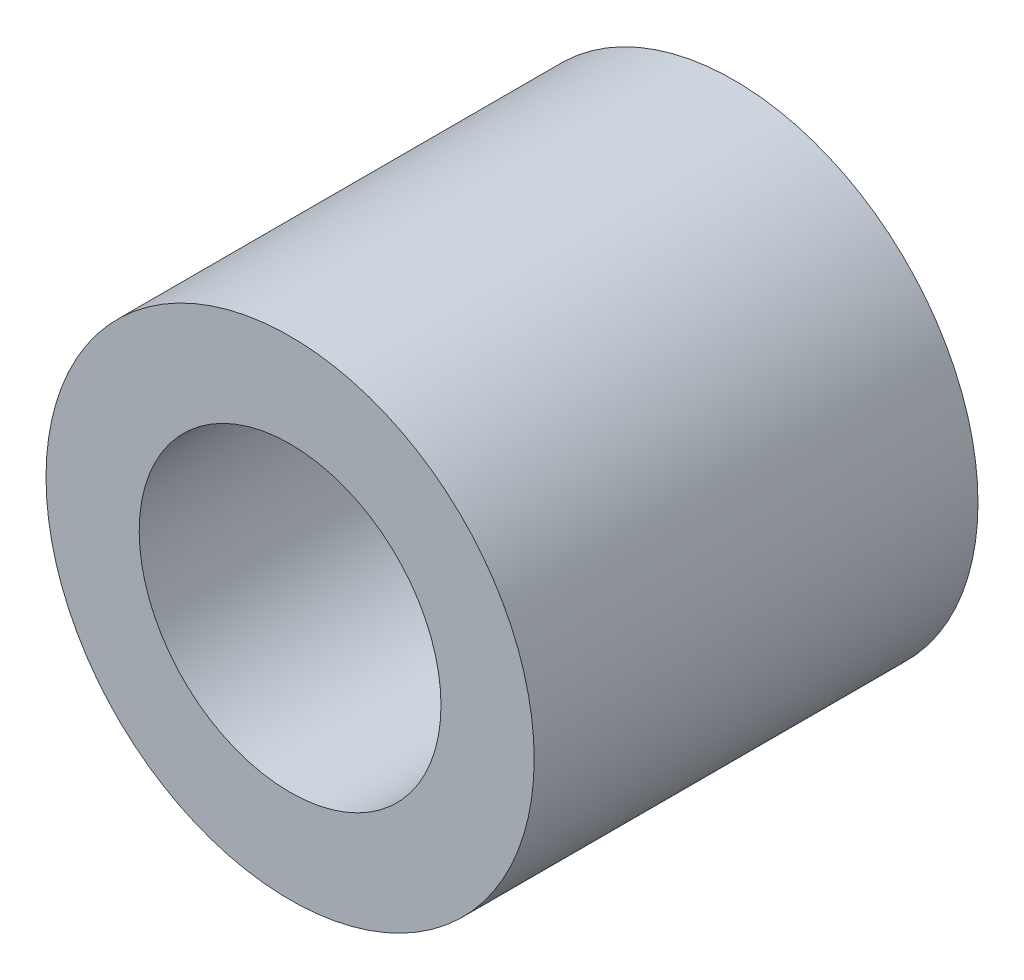
ISO-10303-21;
HEADER;
FILE_DESCRIPTION(('STEP AP214'),'2;1');
FILE_NAME('part.step','',(''),(''),'','','');
FILE_SCHEMA(('AUTOMOTIVE_DESIGN { 1 0 10303 214 1 1 1 1 }'));
ENDSEC;
DATA;
#1=APPLICATION_CONTEXT('core data for automotive mechanical design processes');
#2=APPLICATION_PROTOCOL_DEFINITION('international standard','automotive_design',2000,#1);
#3=PRODUCT_CONTEXT('',#1,'mechanical');
#4=PRODUCT('Part','Part','',(#3));
#5=PRODUCT_RELATED_PRODUCT_CATEGORY('part','',(#4));
#6=PRODUCT_DEFINITION_FORMATION('','',#4);
#7=PRODUCT_DEFINITION_CONTEXT('part definition',#1,'design');
#8=PRODUCT_DEFINITION('design','',#6,#7);
#9=PRODUCT_DEFINITION_SHAPE('','',#8);
#10=(LENGTH_UNIT() NAMED_UNIT(*) SI_UNIT(.MILLI.,.METRE.));
#11=(NAMED_UNIT(*) PLANE_ANGLE_UNIT() SI_UNIT($,.RADIAN.));
#12=(NAMED_UNIT(*) SI_UNIT($,.STERADIAN.) SOLID_ANGLE_UNIT());
#13=UNCERTAINTY_MEASURE_WITH_UNIT(LENGTH_MEASURE(1.E-05),#10,'distance_accuracy_value','');
#14=(GEOMETRIC_REPRESENTATION_CONTEXT(3) GLOBAL_UNCERTAINTY_ASSIGNED_CONTEXT((#13)) GLOBAL_UNIT_ASSIGNED_CONTEXT((#10,
#11,#12)) REPRESENTATION_CONTEXT('',''));
#15=CARTESIAN_POINT('',(0.,0.,0.));
#16=DIRECTION('',(0.,0.,1.));
#17=DIRECTION('',(1.,0.,0.));
#18=AXIS2_PLACEMENT_3D('',#15,#16,#17);
#19=CARTESIAN_POINT('',(0.,0.,5.));
#20=DIRECTION('',(0.,0.,1.));
#21=DIRECTION('',(1.,0.,0.));
#22=AXIS2_PLACEMENT_3D('',#19,#20,#21);
#23=PLANE('',#22);
#24=CARTESIAN_POINT('',(0.,0.,5.));
#25=DIRECTION('',(0.,0.,1.));
#26=DIRECTION('',(1.,0.,0.));
#27=AXIS2_PLACEMENT_3D('',#24,#25,#26);
#28=CIRCLE('',#27,2.75);
#29=CARTESIAN_POINT('',(2.75,0.,5.));
#30=VERTEX_POINT('',#29);
#31=EDGE_CURVE('E10',#30,#30,#28,.T.);
#32=ORIENTED_EDGE('',*,*,#31,.T.);
#33=EDGE_LOOP('',(#32));
#34=FACE_BOUND('',#33,.T.);
#35=CARTESIAN_POINT('',(0.,0.,5.));
#36=DIRECTION('',(0.,0.,1.));
#37=DIRECTION('',(1.,0.,0.));
#38=AXIS2_PLACEMENT_3D('',#35,#36,#37);
#39=CIRCLE('',#38,1.7);
#40=CARTESIAN_POINT('',(1.7,0.,5.));
#41=VERTEX_POINT('',#40);
#42=EDGE_CURVE('E56',#41,#41,#39,.T.);
#43=ORIENTED_EDGE('',*,*,#42,.F.);
#44=EDGE_LOOP('',(#43));
#45=FACE_BOUND('',#44,.T.);
#46=ADVANCED_FACE('F43',(#34,#45),#23,.T.);
#47=CARTESIAN_POINT('',(0.,0.,0.));
#48=DIRECTION('',(0.,0.,1.));
#49=DIRECTION('',(1.,0.,0.));
#50=AXIS2_PLACEMENT_3D('',#47,#48,#49);
#51=PLANE('',#50);
#52=CARTESIAN_POINT('',(0.,0.,0.));
#53=DIRECTION('',(0.,0.,1.));
#54=DIRECTION('',(1.,0.,0.));
#55=AXIS2_PLACEMENT_3D('',#52,#53,#54);
#56=CIRCLE('',#55,2.75);
#57=CARTESIAN_POINT('',(2.75,0.,0.));
#58=VERTEX_POINT('',#57);
#59=EDGE_CURVE('E47',#58,#58,#56,.T.);
#60=ORIENTED_EDGE('',*,*,#59,.F.);
#61=EDGE_LOOP('',(#60));
#62=FACE_BOUND('',#61,.T.);
#63=CARTESIAN_POINT('',(0.,0.,0.));
#64=DIRECTION('',(0.,0.,1.));
#65=DIRECTION('',(1.,0.,0.));
#66=AXIS2_PLACEMENT_3D('',#63,#64,#65);
#67=CIRCLE('',#66,1.7);
#68=CARTESIAN_POINT('',(1.7,0.,0.));
#69=VERTEX_POINT('',#68);
#70=EDGE_CURVE('E58',#69,#69,#67,.T.);
#71=ORIENTED_EDGE('',*,*,#70,.T.);
#72=EDGE_LOOP('',(#71));
#73=FACE_BOUND('',#72,.T.);
#74=ADVANCED_FACE('F70',(#62,#73),#51,.F.);
#75=CARTESIAN_POINT('',(0.,0.,5.));
#76=DIRECTION('',(0.,0.,-1.));
#77=DIRECTION('',(-1.,0.,0.));
#78=AXIS2_PLACEMENT_3D('',#75,#76,#77);
#79=CYLINDRICAL_SURFACE('',#78,2.75);
#80=ORIENTED_EDGE('',*,*,#31,.F.);
#81=EDGE_LOOP('',(#80));
#82=FACE_BOUND('',#81,.T.);
#83=ORIENTED_EDGE('',*,*,#59,.T.);
#84=EDGE_LOOP('',(#83));
#85=FACE_BOUND('',#84,.T.);
#86=ADVANCED_FACE('F45',(#82,#85),#79,.T.);
#87=CARTESIAN_POINT('',(0.,0.,5.));
#88=DIRECTION('',(0.,0.,-1.));
#89=DIRECTION('',(-1.,0.,0.));
#90=AXIS2_PLACEMENT_3D('',#87,#88,#89);
#91=CYLINDRICAL_SURFACE('',#90,1.7);
#92=ORIENTED_EDGE('',*,*,#42,.T.);
#93=EDGE_LOOP('',(#92));
#94=FACE_BOUND('',#93,.T.);
#95=ORIENTED_EDGE('',*,*,#70,.F.);
#96=EDGE_LOOP('',(#95));
#97=FACE_BOUND('',#96,.T.);
#98=ADVANCED_FACE('F66',(#94,#97),#91,.F.);
#99=CLOSED_SHELL('',(#46,#74,#86,#98));
#100=MANIFOLD_SOLID_BREP('B2',#99);
#101=ADVANCED_BREP_SHAPE_REPRESENTATION('',(#18,#100),#14);
#102=SHAPE_DEFINITION_REPRESENTATION(#9,#101);
ENDSEC;
END-ISO-10303-21;
